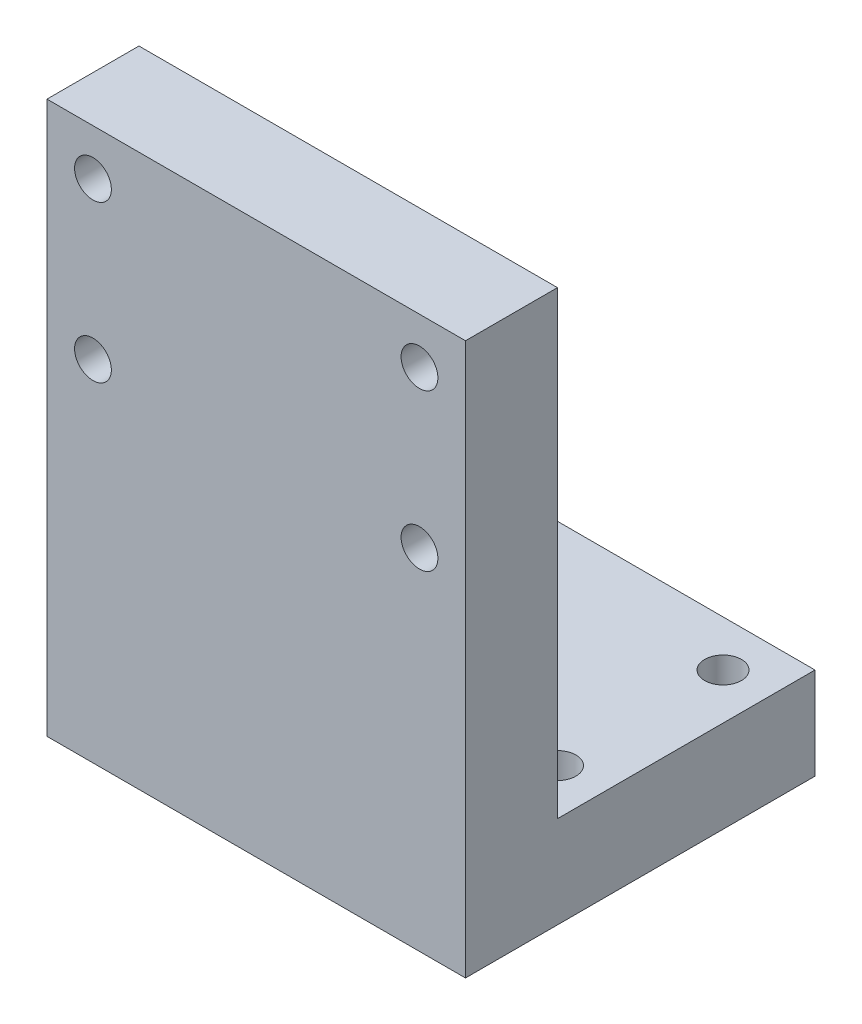
ISO-10303-21;
HEADER;
FILE_DESCRIPTION(('STEP AP214'),'2;1');
FILE_NAME('part.step','',(''),(''),'','','');
FILE_SCHEMA(('AUTOMOTIVE_DESIGN { 1 0 10303 214 1 1 1 1 }'));
ENDSEC;
DATA;
#1=APPLICATION_CONTEXT('core data for automotive mechanical design processes');
#2=APPLICATION_PROTOCOL_DEFINITION('international standard','automotive_design',2000,#1);
#3=PRODUCT_CONTEXT('',#1,'mechanical');
#4=PRODUCT('Part','Part','',(#3));
#5=PRODUCT_RELATED_PRODUCT_CATEGORY('part','',(#4));
#6=PRODUCT_DEFINITION_FORMATION('','',#4);
#7=PRODUCT_DEFINITION_CONTEXT('part definition',#1,'design');
#8=PRODUCT_DEFINITION('design','',#6,#7);
#9=PRODUCT_DEFINITION_SHAPE('','',#8);
#10=(LENGTH_UNIT() NAMED_UNIT(*) SI_UNIT(.MILLI.,.METRE.));
#11=(NAMED_UNIT(*) PLANE_ANGLE_UNIT() SI_UNIT($,.RADIAN.));
#12=(NAMED_UNIT(*) SI_UNIT($,.STERADIAN.) SOLID_ANGLE_UNIT());
#13=UNCERTAINTY_MEASURE_WITH_UNIT(LENGTH_MEASURE(1.E-05),#10,'distance_accuracy_value','');
#14=(GEOMETRIC_REPRESENTATION_CONTEXT(3) GLOBAL_UNCERTAINTY_ASSIGNED_CONTEXT((#13)) GLOBAL_UNIT_ASSIGNED_CONTEXT((#10,
#11,#12)) REPRESENTATION_CONTEXT('',''));
#15=CARTESIAN_POINT('',(0.,0.,0.));
#16=DIRECTION('',(0.,0.,1.));
#17=DIRECTION('',(1.,0.,0.));
#18=AXIS2_PLACEMENT_3D('',#15,#16,#17);
#19=CARTESIAN_POINT('',(17.75,55.,24.001));
#20=DIRECTION('',(0.,0.,-1.));
#21=DIRECTION('',(-1.,0.,0.));
#22=AXIS2_PLACEMENT_3D('',#19,#20,#21);
#23=CYLINDRICAL_SURFACE('',#22,2.00000000000001);
#24=CARTESIAN_POINT('',(17.75,55.,24.));
#25=DIRECTION('',(0.,0.,-1.));
#26=DIRECTION('',(-1.,0.,0.));
#27=AXIS2_PLACEMENT_3D('',#24,#25,#26);
#28=CIRCLE('',#27,2.00000000000001);
#29=CARTESIAN_POINT('',(15.75,55.,24.));
#30=VERTEX_POINT('',#29);
#31=EDGE_CURVE('E182',#30,#30,#28,.F.);
#32=ORIENTED_EDGE('',*,*,#31,.T.);
#33=EDGE_LOOP('',(#32));
#34=FACE_BOUND('',#33,.T.);
#35=CARTESIAN_POINT('',(17.75,55.,20.));
#36=DIRECTION('',(0.,0.,-1.));
#37=DIRECTION('',(-1.,0.,0.));
#38=AXIS2_PLACEMENT_3D('',#35,#36,#37);
#39=CIRCLE('',#38,2.00000000000001);
#40=CARTESIAN_POINT('',(15.75,55.,20.));
#41=VERTEX_POINT('',#40);
#42=EDGE_CURVE('E49',#41,#41,#39,.F.);
#43=ORIENTED_EDGE('',*,*,#42,.F.);
#44=EDGE_LOOP('',(#43));
#45=FACE_BOUND('',#44,.T.);
#46=ADVANCED_FACE('F45',(#34,#45),#23,.F.);
#47=CARTESIAN_POINT('',(17.75,38.,24.001));
#48=DIRECTION('',(0.,0.,-1.));
#49=DIRECTION('',(-1.,0.,0.));
#50=AXIS2_PLACEMENT_3D('',#47,#48,#49);
#51=CYLINDRICAL_SURFACE('',#50,2.00000000000001);
#52=CARTESIAN_POINT('',(17.75,38.,24.));
#53=DIRECTION('',(0.,0.,-1.));
#54=DIRECTION('',(-1.,0.,0.));
#55=AXIS2_PLACEMENT_3D('',#52,#53,#54);
#56=CIRCLE('',#55,2.00000000000001);
#57=CARTESIAN_POINT('',(15.75,38.,24.));
#58=VERTEX_POINT('',#57);
#59=EDGE_CURVE('E178',#58,#58,#56,.F.);
#60=ORIENTED_EDGE('',*,*,#59,.T.);
#61=EDGE_LOOP('',(#60));
#62=FACE_BOUND('',#61,.T.);
#63=CARTESIAN_POINT('',(17.75,38.,20.));
#64=DIRECTION('',(0.,0.,-1.));
#65=DIRECTION('',(-1.,0.,0.));
#66=AXIS2_PLACEMENT_3D('',#63,#64,#65);
#67=CIRCLE('',#66,2.00000000000001);
#68=CARTESIAN_POINT('',(15.75,38.,20.));
#69=VERTEX_POINT('',#68);
#70=EDGE_CURVE('E160',#69,#69,#67,.F.);
#71=ORIENTED_EDGE('',*,*,#70,.F.);
#72=EDGE_LOOP('',(#71));
#73=FACE_BOUND('',#72,.T.);
#74=ADVANCED_FACE('F318',(#62,#73),#51,.F.);
#75=CARTESIAN_POINT('',(-17.75,10.,-9.));
#76=DIRECTION('',(0.,-1.,0.));
#77=DIRECTION('',(0.,0.,-1.));
#78=AXIS2_PLACEMENT_3D('',#75,#76,#77);
#79=CYLINDRICAL_SURFACE('',#78,2.00000000000001);
#80=CARTESIAN_POINT('',(-17.75,10.,-9.));
#81=DIRECTION('',(0.,1.,0.));
#82=DIRECTION('',(0.,0.,1.));
#83=AXIS2_PLACEMENT_3D('',#80,#81,#82);
#84=CIRCLE('',#83,2.00000000000001);
#85=CARTESIAN_POINT('',(-17.75,10.,-6.99999999999999));
#86=VERTEX_POINT('',#85);
#87=EDGE_CURVE('E126',#86,#86,#84,.T.);
#88=ORIENTED_EDGE('',*,*,#87,.T.);
#89=EDGE_LOOP('',(#88));
#90=FACE_BOUND('',#89,.T.);
#91=CARTESIAN_POINT('',(-17.75,6.,-9.));
#92=DIRECTION('',(0.,-1.,0.));
#93=DIRECTION('',(0.,0.,-1.));
#94=AXIS2_PLACEMENT_3D('',#91,#92,#93);
#95=CIRCLE('',#94,2.00000000000001);
#96=CARTESIAN_POINT('',(-17.75,6.,-11.));
#97=VERTEX_POINT('',#96);
#98=EDGE_CURVE('E147',#97,#97,#95,.T.);
#99=ORIENTED_EDGE('',*,*,#98,.T.);
#100=EDGE_LOOP('',(#99));
#101=FACE_BOUND('',#100,.T.);
#102=ADVANCED_FACE('F325',(#90,#101),#79,.F.);
#103=CARTESIAN_POINT('',(-17.75,10.,9.));
#104=DIRECTION('',(0.,-1.,0.));
#105=DIRECTION('',(0.,0.,-1.));
#106=AXIS2_PLACEMENT_3D('',#103,#104,#105);
#107=CYLINDRICAL_SURFACE('',#106,2.00000000000001);
#108=CARTESIAN_POINT('',(-17.75,10.,9.));
#109=DIRECTION('',(0.,1.,0.));
#110=DIRECTION('',(0.,0.,1.));
#111=AXIS2_PLACEMENT_3D('',#108,#109,#110);
#112=CIRCLE('',#111,2.00000000000001);
#113=CARTESIAN_POINT('',(-17.75,10.,11.));
#114=VERTEX_POINT('',#113);
#115=EDGE_CURVE('E251',#114,#114,#112,.T.);
#116=ORIENTED_EDGE('',*,*,#115,.T.);
#117=EDGE_LOOP('',(#116));
#118=FACE_BOUND('',#117,.T.);
#119=CARTESIAN_POINT('',(-17.75,6.,9.));
#120=DIRECTION('',(0.,-1.,0.));
#121=DIRECTION('',(0.,0.,-1.));
#122=AXIS2_PLACEMENT_3D('',#119,#120,#121);
#123=CIRCLE('',#122,2.00000000000001);
#124=CARTESIAN_POINT('',(-17.75,6.,6.99999999999998));
#125=VERTEX_POINT('',#124);
#126=EDGE_CURVE('E143',#125,#125,#123,.T.);
#127=ORIENTED_EDGE('',*,*,#126,.T.);
#128=EDGE_LOOP('',(#127));
#129=FACE_BOUND('',#128,.T.);
#130=ADVANCED_FACE('F378',(#118,#129),#107,.F.);
#131=CARTESIAN_POINT('',(0.,10.,0.));
#132=DIRECTION('',(0.,1.,0.));
#133=DIRECTION('',(0.,0.,1.));
#134=AXIS2_PLACEMENT_3D('',#131,#132,#133);
#135=PLANE('',#134);
#136=CARTESIAN_POINT('',(17.75,10.,-9.00000000000001));
#137=DIRECTION('',(0.,1.,0.));
#138=DIRECTION('',(0.,0.,1.));
#139=AXIS2_PLACEMENT_3D('',#136,#137,#138);
#140=CIRCLE('',#139,2.00000000000001);
#141=CARTESIAN_POINT('',(17.75,10.,-6.99999999999999));
#142=VERTEX_POINT('',#141);
#143=EDGE_CURVE('E247',#142,#142,#140,.T.);
#144=ORIENTED_EDGE('',*,*,#143,.F.);
#145=EDGE_LOOP('',(#144));
#146=FACE_BOUND('',#145,.T.);
#147=ORIENTED_EDGE('',*,*,#87,.F.);
#148=EDGE_LOOP('',(#147));
#149=FACE_BOUND('',#148,.T.);
#150=DIRECTION('',(0.,0.,1.));
#151=VECTOR('',#150,1.);
#152=CARTESIAN_POINT('',(-22.75,10.,-14.));
#153=LINE('',#152,#151);
#154=CARTESIAN_POINT('',(-22.75,10.,-14.));
#155=VERTEX_POINT('',#154);
#156=CARTESIAN_POINT('',(-22.75,10.,14.));
#157=VERTEX_POINT('',#156);
#158=EDGE_CURVE('E111',#155,#157,#153,.T.);
#159=ORIENTED_EDGE('',*,*,#158,.T.);
#160=DIRECTION('',(1.,0.,0.));
#161=VECTOR('',#160,1.);
#162=CARTESIAN_POINT('',(-22.75,10.,14.));
#163=LINE('',#162,#161);
#164=CARTESIAN_POINT('',(22.75,10.,14.));
#165=VERTEX_POINT('',#164);
#166=EDGE_CURVE('E86',#157,#165,#163,.T.);
#167=ORIENTED_EDGE('',*,*,#166,.T.);
#168=DIRECTION('',(0.,0.,-1.));
#169=VECTOR('',#168,1.);
#170=CARTESIAN_POINT('',(22.75,10.,-14.));
#171=LINE('',#170,#169);
#172=CARTESIAN_POINT('',(22.75,10.,-14.));
#173=VERTEX_POINT('',#172);
#174=EDGE_CURVE('E108',#165,#173,#171,.T.);
#175=ORIENTED_EDGE('',*,*,#174,.T.);
#176=DIRECTION('',(-1.,0.,0.));
#177=VECTOR('',#176,1.);
#178=CARTESIAN_POINT('',(0.,10.,-14.));
#179=LINE('',#178,#177);
#180=EDGE_CURVE('E65',#173,#155,#179,.T.);
#181=ORIENTED_EDGE('',*,*,#180,.T.);
#182=EDGE_LOOP('',(#159,#167,#175,#181));
#183=FACE_BOUND('',#182,.T.);
#184=ORIENTED_EDGE('',*,*,#115,.F.);
#185=EDGE_LOOP('',(#184));
#186=FACE_BOUND('',#185,.T.);
#187=CARTESIAN_POINT('',(17.75,10.,9.));
#188=DIRECTION('',(0.,1.,0.));
#189=DIRECTION('',(0.,0.,1.));
#190=AXIS2_PLACEMENT_3D('',#187,#188,#189);
#191=CIRCLE('',#190,2.00000000000001);
#192=CARTESIAN_POINT('',(17.75,10.,11.));
#193=VERTEX_POINT('',#192);
#194=EDGE_CURVE('E151',#193,#193,#191,.T.);
#195=ORIENTED_EDGE('',*,*,#194,.F.);
#196=EDGE_LOOP('',(#195));
#197=FACE_BOUND('',#196,.T.);
#198=ADVANCED_FACE('F106',(#146,#149,#183,#186,#197),#135,.T.);
#199=CARTESIAN_POINT('',(0.,0.,0.));
#200=DIRECTION('',(0.,1.,0.));
#201=DIRECTION('',(0.,0.,1.));
#202=AXIS2_PLACEMENT_3D('',#199,#200,#201);
#203=PLANE('',#202);
#204=CARTESIAN_POINT('',(17.75,0.,9.));
#205=DIRECTION('',(0.,-1.,0.));
#206=DIRECTION('',(0.,0.,1.));
#207=AXIS2_PLACEMENT_3D('',#204,#205,#206);
#208=CIRCLE('',#207,3.);
#209=CARTESIAN_POINT('',(17.75,0.,12.));
#210=VERTEX_POINT('',#209);
#211=EDGE_CURVE('E231',#210,#210,#208,.T.);
#212=ORIENTED_EDGE('',*,*,#211,.F.);
#213=EDGE_LOOP('',(#212));
#214=FACE_BOUND('',#213,.T.);
#215=CARTESIAN_POINT('',(17.75,0.,-9.));
#216=DIRECTION('',(0.,-1.,0.));
#217=DIRECTION('',(0.,0.,1.));
#218=AXIS2_PLACEMENT_3D('',#215,#216,#217);
#219=CIRCLE('',#218,3.);
#220=CARTESIAN_POINT('',(17.75,0.,-6.));
#221=VERTEX_POINT('',#220);
#222=EDGE_CURVE('E223',#221,#221,#219,.T.);
#223=ORIENTED_EDGE('',*,*,#222,.F.);
#224=EDGE_LOOP('',(#223));
#225=FACE_BOUND('',#224,.T.);
#226=CARTESIAN_POINT('',(-17.75,0.,-9.));
#227=DIRECTION('',(0.,-1.,0.));
#228=DIRECTION('',(0.,0.,-1.));
#229=AXIS2_PLACEMENT_3D('',#226,#227,#228);
#230=CIRCLE('',#229,3.);
#231=CARTESIAN_POINT('',(-17.75,0.,-12.));
#232=VERTEX_POINT('',#231);
#233=EDGE_CURVE('E214',#232,#232,#230,.T.);
#234=ORIENTED_EDGE('',*,*,#233,.F.);
#235=EDGE_LOOP('',(#234));
#236=FACE_BOUND('',#235,.T.);
#237=CARTESIAN_POINT('',(-17.75,0.,9.));
#238=DIRECTION('',(0.,-1.,0.));
#239=DIRECTION('',(0.,0.,-1.));
#240=AXIS2_PLACEMENT_3D('',#237,#238,#239);
#241=CIRCLE('',#240,3.);
#242=CARTESIAN_POINT('',(-17.75,0.,6.));
#243=VERTEX_POINT('',#242);
#244=EDGE_CURVE('E218',#243,#243,#241,.T.);
#245=ORIENTED_EDGE('',*,*,#244,.F.);
#246=EDGE_LOOP('',(#245));
#247=FACE_BOUND('',#246,.T.);
#248=DIRECTION('',(0.,0.,1.));
#249=VECTOR('',#248,1.);
#250=CARTESIAN_POINT('',(-22.75,0.,-14.));
#251=LINE('',#250,#249);
#252=CARTESIAN_POINT('',(-22.75,0.,-14.));
#253=VERTEX_POINT('',#252);
#254=CARTESIAN_POINT('',(-22.75,0.,24.));
#255=VERTEX_POINT('',#254);
#256=EDGE_CURVE('E121',#253,#255,#251,.T.);
#257=ORIENTED_EDGE('',*,*,#256,.F.);
#258=DIRECTION('',(-1.,0.,0.));
#259=VECTOR('',#258,1.);
#260=CARTESIAN_POINT('',(-22.75,0.,-14.));
#261=LINE('',#260,#259);
#262=CARTESIAN_POINT('',(22.75,0.,-14.));
#263=VERTEX_POINT('',#262);
#264=EDGE_CURVE('E77',#263,#253,#261,.T.);
#265=ORIENTED_EDGE('',*,*,#264,.F.);
#266=DIRECTION('',(0.,0.,-1.));
#267=VECTOR('',#266,1.);
#268=CARTESIAN_POINT('',(22.75,0.,-14.));
#269=LINE('',#268,#267);
#270=CARTESIAN_POINT('',(22.75,0.,24.));
#271=VERTEX_POINT('',#270);
#272=EDGE_CURVE('E125',#271,#263,#269,.T.);
#273=ORIENTED_EDGE('',*,*,#272,.F.);
#274=DIRECTION('',(1.,0.,0.));
#275=VECTOR('',#274,1.);
#276=CARTESIAN_POINT('',(22.75,0.,24.));
#277=LINE('',#276,#275);
#278=EDGE_CURVE('E186',#255,#271,#277,.T.);
#279=ORIENTED_EDGE('',*,*,#278,.F.);
#280=EDGE_LOOP('',(#257,#265,#273,#279));
#281=FACE_BOUND('',#280,.T.);
#282=ADVANCED_FACE('F387',(#214,#225,#236,#247,#281),#203,.F.);
#283=CARTESIAN_POINT('',(-22.75,10.,-14.));
#284=DIRECTION('',(1.,0.,0.));
#285=DIRECTION('',(0.,0.,-1.));
#286=AXIS2_PLACEMENT_3D('',#283,#284,#285);
#287=PLANE('',#286);
#288=ORIENTED_EDGE('',*,*,#256,.T.);
#289=DIRECTION('',(0.,-1.,0.));
#290=VECTOR('',#289,1.);
#291=CARTESIAN_POINT('',(-22.75,60.,24.));
#292=LINE('',#291,#290);
#293=CARTESIAN_POINT('',(-22.75,60.,24.));
#294=VERTEX_POINT('',#293);
#295=EDGE_CURVE('E209',#294,#255,#292,.T.);
#296=ORIENTED_EDGE('',*,*,#295,.F.);
#297=DIRECTION('',(0.,0.,1.));
#298=VECTOR('',#297,1.);
#299=CARTESIAN_POINT('',(-22.75,60.,24.));
#300=LINE('',#299,#298);
#301=CARTESIAN_POINT('',(-22.75,60.,14.));
#302=VERTEX_POINT('',#301);
#303=EDGE_CURVE('E187',#302,#294,#300,.T.);
#304=ORIENTED_EDGE('',*,*,#303,.F.);
#305=DIRECTION('',(0.,-1.,0.));
#306=VECTOR('',#305,1.);
#307=CARTESIAN_POINT('',(-22.75,60.,14.));
#308=LINE('',#307,#306);
#309=EDGE_CURVE('E104',#302,#157,#308,.T.);
#310=ORIENTED_EDGE('',*,*,#309,.T.);
#311=ORIENTED_EDGE('',*,*,#158,.F.);
#312=DIRECTION('',(0.,-1.,0.));
#313=VECTOR('',#312,1.);
#314=CARTESIAN_POINT('',(-22.75,10.,-14.));
#315=LINE('',#314,#313);
#316=EDGE_CURVE('E56',#155,#253,#315,.T.);
#317=ORIENTED_EDGE('',*,*,#316,.T.);
#318=EDGE_LOOP('',(#288,#296,#304,#310,#311,#317));
#319=FACE_BOUND('',#318,.T.);
#320=ADVANCED_FACE('F47',(#319),#287,.F.);
#321=CARTESIAN_POINT('',(22.75,10.,-14.));
#322=DIRECTION('',(-1.,0.,0.));
#323=DIRECTION('',(0.,0.,1.));
#324=AXIS2_PLACEMENT_3D('',#321,#322,#323);
#325=PLANE('',#324);
#326=ORIENTED_EDGE('',*,*,#272,.T.);
#327=DIRECTION('',(0.,-1.,0.));
#328=VECTOR('',#327,1.);
#329=CARTESIAN_POINT('',(22.75,10.,-14.));
#330=LINE('',#329,#328);
#331=EDGE_CURVE('E11',#173,#263,#330,.T.);
#332=ORIENTED_EDGE('',*,*,#331,.F.);
#333=ORIENTED_EDGE('',*,*,#174,.F.);
#334=DIRECTION('',(0.,-1.,0.));
#335=VECTOR('',#334,1.);
#336=CARTESIAN_POINT('',(22.75,60.,14.));
#337=LINE('',#336,#335);
#338=CARTESIAN_POINT('',(22.75,60.,14.));
#339=VERTEX_POINT('',#338);
#340=EDGE_CURVE('E96',#339,#165,#337,.T.);
#341=ORIENTED_EDGE('',*,*,#340,.F.);
#342=DIRECTION('',(0.,0.,-1.));
#343=VECTOR('',#342,1.);
#344=CARTESIAN_POINT('',(22.75,60.,14.));
#345=LINE('',#344,#343);
#346=CARTESIAN_POINT('',(22.75,60.,24.));
#347=VERTEX_POINT('',#346);
#348=EDGE_CURVE('E195',#347,#339,#345,.T.);
#349=ORIENTED_EDGE('',*,*,#348,.F.);
#350=DIRECTION('',(0.,-1.,0.));
#351=VECTOR('',#350,1.);
#352=CARTESIAN_POINT('',(22.75,60.,24.));
#353=LINE('',#352,#351);
#354=EDGE_CURVE('E103',#347,#271,#353,.T.);
#355=ORIENTED_EDGE('',*,*,#354,.T.);
#356=EDGE_LOOP('',(#326,#332,#333,#341,#349,#355));
#357=FACE_BOUND('',#356,.T.);
#358=ADVANCED_FACE('F114',(#357),#325,.F.);
#359=CARTESIAN_POINT('',(-22.75,10.,-14.));
#360=DIRECTION('',(0.,0.,1.));
#361=DIRECTION('',(1.,0.,0.));
#362=AXIS2_PLACEMENT_3D('',#359,#360,#361);
#363=PLANE('',#362);
#364=ORIENTED_EDGE('',*,*,#264,.T.);
#365=ORIENTED_EDGE('',*,*,#316,.F.);
#366=ORIENTED_EDGE('',*,*,#180,.F.);
#367=ORIENTED_EDGE('',*,*,#331,.T.);
#368=EDGE_LOOP('',(#364,#365,#366,#367));
#369=FACE_BOUND('',#368,.T.);
#370=ADVANCED_FACE('F376',(#369),#363,.F.);
#371=CARTESIAN_POINT('',(17.75,10.,-9.00000000000001));
#372=DIRECTION('',(0.,-1.,0.));
#373=DIRECTION('',(0.,0.,-1.));
#374=AXIS2_PLACEMENT_3D('',#371,#372,#373);
#375=CYLINDRICAL_SURFACE('',#374,2.00000000000001);
#376=CARTESIAN_POINT('',(17.75,6.,-9.00000000000001));
#377=DIRECTION('',(0.,1.,0.));
#378=DIRECTION('',(0.,0.,1.));
#379=AXIS2_PLACEMENT_3D('',#376,#377,#378);
#380=CIRCLE('',#379,2.00000000000001);
#381=CARTESIAN_POINT('',(17.75,6.,-6.99999999999999));
#382=VERTEX_POINT('',#381);
#383=EDGE_CURVE('E138',#382,#382,#380,.T.);
#384=ORIENTED_EDGE('',*,*,#383,.F.);
#385=EDGE_LOOP('',(#384));
#386=FACE_BOUND('',#385,.T.);
#387=ORIENTED_EDGE('',*,*,#143,.T.);
#388=EDGE_LOOP('',(#387));
#389=FACE_BOUND('',#388,.T.);
#390=ADVANCED_FACE('F372',(#386,#389),#375,.F.);
#391=CARTESIAN_POINT('',(17.75,10.,9.));
#392=DIRECTION('',(0.,-1.,0.));
#393=DIRECTION('',(0.,0.,-1.));
#394=AXIS2_PLACEMENT_3D('',#391,#392,#393);
#395=CYLINDRICAL_SURFACE('',#394,2.00000000000001);
#396=CARTESIAN_POINT('',(17.75,6.,9.));
#397=DIRECTION('',(0.,1.,0.));
#398=DIRECTION('',(0.,0.,1.));
#399=AXIS2_PLACEMENT_3D('',#396,#397,#398);
#400=CIRCLE('',#399,2.00000000000001);
#401=CARTESIAN_POINT('',(17.75,6.,11.));
#402=VERTEX_POINT('',#401);
#403=EDGE_CURVE('E134',#402,#402,#400,.T.);
#404=ORIENTED_EDGE('',*,*,#403,.F.);
#405=EDGE_LOOP('',(#404));
#406=FACE_BOUND('',#405,.T.);
#407=ORIENTED_EDGE('',*,*,#194,.T.);
#408=EDGE_LOOP('',(#407));
#409=FACE_BOUND('',#408,.T.);
#410=ADVANCED_FACE('F359',(#406,#409),#395,.F.);
#411=CARTESIAN_POINT('',(17.75,6.,9.));
#412=DIRECTION('',(0.,-1.,0.));
#413=DIRECTION('',(0.,0.,-1.));
#414=AXIS2_PLACEMENT_3D('',#411,#412,#413);
#415=CYLINDRICAL_SURFACE('',#414,3.);
#416=CARTESIAN_POINT('',(17.75,6.,9.));
#417=DIRECTION('',(0.,-1.,0.));
#418=DIRECTION('',(0.,0.,1.));
#419=AXIS2_PLACEMENT_3D('',#416,#417,#418);
#420=CIRCLE('',#419,3.);
#421=CARTESIAN_POINT('',(17.75,6.,12.));
#422=VERTEX_POINT('',#421);
#423=EDGE_CURVE('E213',#422,#422,#420,.T.);
#424=ORIENTED_EDGE('',*,*,#423,.F.);
#425=EDGE_LOOP('',(#424));
#426=FACE_BOUND('',#425,.T.);
#427=ORIENTED_EDGE('',*,*,#211,.T.);
#428=EDGE_LOOP('',(#427));
#429=FACE_BOUND('',#428,.T.);
#430=ADVANCED_FACE('F356',(#426,#429),#415,.F.);
#431=CARTESIAN_POINT('',(17.75,6.,9.));
#432=DIRECTION('',(0.,1.,0.));
#433=DIRECTION('',(0.,0.,1.));
#434=AXIS2_PLACEMENT_3D('',#431,#432,#433);
#435=PLANE('',#434);
#436=ORIENTED_EDGE('',*,*,#403,.T.);
#437=EDGE_LOOP('',(#436));
#438=FACE_BOUND('',#437,.T.);
#439=ORIENTED_EDGE('',*,*,#423,.T.);
#440=EDGE_LOOP('',(#439));
#441=FACE_BOUND('',#440,.T.);
#442=ADVANCED_FACE('F350',(#438,#441),#435,.F.);
#443=CARTESIAN_POINT('',(17.75,6.,-9.));
#444=DIRECTION('',(0.,-1.,0.));
#445=DIRECTION('',(0.,0.,-1.));
#446=AXIS2_PLACEMENT_3D('',#443,#444,#445);
#447=CYLINDRICAL_SURFACE('',#446,3.);
#448=CARTESIAN_POINT('',(17.75,6.,-9.));
#449=DIRECTION('',(0.,-1.,0.));
#450=DIRECTION('',(0.,0.,1.));
#451=AXIS2_PLACEMENT_3D('',#448,#449,#450);
#452=CIRCLE('',#451,3.);
#453=CARTESIAN_POINT('',(17.75,6.,-6.));
#454=VERTEX_POINT('',#453);
#455=EDGE_CURVE('E227',#454,#454,#452,.T.);
#456=ORIENTED_EDGE('',*,*,#455,.F.);
#457=EDGE_LOOP('',(#456));
#458=FACE_BOUND('',#457,.T.);
#459=ORIENTED_EDGE('',*,*,#222,.T.);
#460=EDGE_LOOP('',(#459));
#461=FACE_BOUND('',#460,.T.);
#462=ADVANCED_FACE('F346',(#458,#461),#447,.F.);
#463=CARTESIAN_POINT('',(17.75,6.,-9.));
#464=DIRECTION('',(0.,1.,0.));
#465=DIRECTION('',(0.,0.,1.));
#466=AXIS2_PLACEMENT_3D('',#463,#464,#465);
#467=PLANE('',#466);
#468=ORIENTED_EDGE('',*,*,#383,.T.);
#469=EDGE_LOOP('',(#468));
#470=FACE_BOUND('',#469,.T.);
#471=ORIENTED_EDGE('',*,*,#455,.T.);
#472=EDGE_LOOP('',(#471));
#473=FACE_BOUND('',#472,.T.);
#474=ADVANCED_FACE('F349',(#470,#473),#467,.F.);
#475=CARTESIAN_POINT('',(-17.75,6.,9.));
#476=DIRECTION('',(0.,-1.,0.));
#477=DIRECTION('',(0.,0.,-1.));
#478=AXIS2_PLACEMENT_3D('',#475,#476,#477);
#479=CYLINDRICAL_SURFACE('',#478,3.);
#480=CARTESIAN_POINT('',(-17.75,6.,9.));
#481=DIRECTION('',(0.,-1.,0.));
#482=DIRECTION('',(0.,0.,-1.));
#483=AXIS2_PLACEMENT_3D('',#480,#481,#482);
#484=CIRCLE('',#483,3.);
#485=CARTESIAN_POINT('',(-17.75,6.,6.));
#486=VERTEX_POINT('',#485);
#487=EDGE_CURVE('E139',#486,#486,#484,.T.);
#488=ORIENTED_EDGE('',*,*,#487,.F.);
#489=EDGE_LOOP('',(#488));
#490=FACE_BOUND('',#489,.T.);
#491=ORIENTED_EDGE('',*,*,#244,.T.);
#492=EDGE_LOOP('',(#491));
#493=FACE_BOUND('',#492,.T.);
#494=ADVANCED_FACE('F354',(#490,#493),#479,.F.);
#495=CARTESIAN_POINT('',(-17.75,6.,9.));
#496=DIRECTION('',(0.,-1.,0.));
#497=DIRECTION('',(0.,0.,-1.));
#498=AXIS2_PLACEMENT_3D('',#495,#496,#497);
#499=PLANE('',#498);
#500=ORIENTED_EDGE('',*,*,#126,.F.);
#501=EDGE_LOOP('',(#500));
#502=FACE_BOUND('',#501,.T.);
#503=ORIENTED_EDGE('',*,*,#487,.T.);
#504=EDGE_LOOP('',(#503));
#505=FACE_BOUND('',#504,.T.);
#506=ADVANCED_FACE('F341',(#502,#505),#499,.T.);
#507=CARTESIAN_POINT('',(-17.75,6.,-9.));
#508=DIRECTION('',(0.,-1.,0.));
#509=DIRECTION('',(0.,0.,-1.));
#510=AXIS2_PLACEMENT_3D('',#507,#508,#509);
#511=CYLINDRICAL_SURFACE('',#510,3.);
#512=CARTESIAN_POINT('',(-17.75,6.,-9.));
#513=DIRECTION('',(0.,-1.,0.));
#514=DIRECTION('',(0.,0.,-1.));
#515=AXIS2_PLACEMENT_3D('',#512,#513,#514);
#516=CIRCLE('',#515,3.);
#517=CARTESIAN_POINT('',(-17.75,6.,-12.));
#518=VERTEX_POINT('',#517);
#519=EDGE_CURVE('E219',#518,#518,#516,.T.);
#520=ORIENTED_EDGE('',*,*,#519,.F.);
#521=EDGE_LOOP('',(#520));
#522=FACE_BOUND('',#521,.T.);
#523=ORIENTED_EDGE('',*,*,#233,.T.);
#524=EDGE_LOOP('',(#523));
#525=FACE_BOUND('',#524,.T.);
#526=ADVANCED_FACE('F338',(#522,#525),#511,.F.);
#527=CARTESIAN_POINT('',(-17.75,6.,-9.));
#528=DIRECTION('',(0.,-1.,0.));
#529=DIRECTION('',(0.,0.,-1.));
#530=AXIS2_PLACEMENT_3D('',#527,#528,#529);
#531=PLANE('',#530);
#532=ORIENTED_EDGE('',*,*,#98,.F.);
#533=EDGE_LOOP('',(#532));
#534=FACE_BOUND('',#533,.T.);
#535=ORIENTED_EDGE('',*,*,#519,.T.);
#536=EDGE_LOOP('',(#535));
#537=FACE_BOUND('',#536,.T.);
#538=ADVANCED_FACE('F336',(#534,#537),#531,.T.);
#539=CARTESIAN_POINT('',(22.75,60.,24.));
#540=DIRECTION('',(0.,0.,-1.));
#541=DIRECTION('',(-1.,0.,0.));
#542=AXIS2_PLACEMENT_3D('',#539,#540,#541);
#543=PLANE('',#542);
#544=CARTESIAN_POINT('',(-17.75,55.,24.));
#545=DIRECTION('',(0.,0.,-1.));
#546=DIRECTION('',(-1.,0.,0.));
#547=AXIS2_PLACEMENT_3D('',#544,#545,#546);
#548=CIRCLE('',#547,2.);
#549=CARTESIAN_POINT('',(-19.75,55.,24.));
#550=VERTEX_POINT('',#549);
#551=EDGE_CURVE('E167',#550,#550,#548,.F.);
#552=ORIENTED_EDGE('',*,*,#551,.F.);
#553=EDGE_LOOP('',(#552));
#554=FACE_BOUND('',#553,.T.);
#555=CARTESIAN_POINT('',(-17.75,38.,24.));
#556=DIRECTION('',(0.,0.,-1.));
#557=DIRECTION('',(-1.,0.,0.));
#558=AXIS2_PLACEMENT_3D('',#555,#556,#557);
#559=CIRCLE('',#558,2.);
#560=CARTESIAN_POINT('',(-19.75,38.,24.));
#561=VERTEX_POINT('',#560);
#562=EDGE_CURVE('E172',#561,#561,#559,.F.);
#563=ORIENTED_EDGE('',*,*,#562,.F.);
#564=EDGE_LOOP('',(#563));
#565=FACE_BOUND('',#564,.T.);
#566=ORIENTED_EDGE('',*,*,#59,.F.);
#567=EDGE_LOOP('',(#566));
#568=FACE_BOUND('',#567,.T.);
#569=ORIENTED_EDGE('',*,*,#31,.F.);
#570=EDGE_LOOP('',(#569));
#571=FACE_BOUND('',#570,.T.);
#572=ORIENTED_EDGE('',*,*,#278,.T.);
#573=ORIENTED_EDGE('',*,*,#354,.F.);
#574=DIRECTION('',(1.,0.,0.));
#575=VECTOR('',#574,1.);
#576=CARTESIAN_POINT('',(22.75,60.,24.));
#577=LINE('',#576,#575);
#578=EDGE_CURVE('E191',#294,#347,#577,.T.);
#579=ORIENTED_EDGE('',*,*,#578,.F.);
#580=ORIENTED_EDGE('',*,*,#295,.T.);
#581=EDGE_LOOP('',(#572,#573,#579,#580));
#582=FACE_BOUND('',#581,.T.);
#583=ADVANCED_FACE('F300',(#554,#565,#568,#571,#582),#543,.F.);
#584=CARTESIAN_POINT('',(-22.75,60.,14.));
#585=DIRECTION('',(0.,0.,1.));
#586=DIRECTION('',(1.,0.,0.));
#587=AXIS2_PLACEMENT_3D('',#584,#585,#586);
#588=PLANE('',#587);
#589=CARTESIAN_POINT('',(-17.75,55.,14.));
#590=DIRECTION('',(0.,0.,-1.));
#591=DIRECTION('',(1.,0.,0.));
#592=AXIS2_PLACEMENT_3D('',#589,#590,#591);
#593=CIRCLE('',#592,3.);
#594=CARTESIAN_POINT('',(-14.75,55.,14.));
#595=VERTEX_POINT('',#594);
#596=EDGE_CURVE('E275',#595,#595,#593,.T.);
#597=ORIENTED_EDGE('',*,*,#596,.F.);
#598=EDGE_LOOP('',(#597));
#599=FACE_BOUND('',#598,.T.);
#600=CARTESIAN_POINT('',(-17.75,38.,14.));
#601=DIRECTION('',(0.,0.,-1.));
#602=DIRECTION('',(1.,0.,0.));
#603=AXIS2_PLACEMENT_3D('',#600,#601,#602);
#604=CIRCLE('',#603,3.);
#605=CARTESIAN_POINT('',(-14.75,38.,14.));
#606=VERTEX_POINT('',#605);
#607=EDGE_CURVE('E283',#606,#606,#604,.T.);
#608=ORIENTED_EDGE('',*,*,#607,.F.);
#609=EDGE_LOOP('',(#608));
#610=FACE_BOUND('',#609,.T.);
#611=CARTESIAN_POINT('',(17.75,38.,14.));
#612=DIRECTION('',(0.,0.,-1.));
#613=DIRECTION('',(-1.,0.,0.));
#614=AXIS2_PLACEMENT_3D('',#611,#612,#613);
#615=CIRCLE('',#614,3.);
#616=CARTESIAN_POINT('',(14.75,38.,14.));
#617=VERTEX_POINT('',#616);
#618=EDGE_CURVE('E267',#617,#617,#615,.T.);
#619=ORIENTED_EDGE('',*,*,#618,.F.);
#620=EDGE_LOOP('',(#619));
#621=FACE_BOUND('',#620,.T.);
#622=CARTESIAN_POINT('',(17.75,55.,14.));
#623=DIRECTION('',(0.,0.,-1.));
#624=DIRECTION('',(-1.,0.,0.));
#625=AXIS2_PLACEMENT_3D('',#622,#623,#624);
#626=CIRCLE('',#625,3.);
#627=CARTESIAN_POINT('',(14.75,55.,14.));
#628=VERTEX_POINT('',#627);
#629=EDGE_CURVE('E263',#628,#628,#626,.T.);
#630=ORIENTED_EDGE('',*,*,#629,.F.);
#631=EDGE_LOOP('',(#630));
#632=FACE_BOUND('',#631,.T.);
#633=ORIENTED_EDGE('',*,*,#166,.F.);
#634=ORIENTED_EDGE('',*,*,#309,.F.);
#635=DIRECTION('',(-1.,0.,0.));
#636=VECTOR('',#635,1.);
#637=CARTESIAN_POINT('',(-22.75,60.,14.));
#638=LINE('',#637,#636);
#639=EDGE_CURVE('E98',#339,#302,#638,.T.);
#640=ORIENTED_EDGE('',*,*,#639,.F.);
#641=ORIENTED_EDGE('',*,*,#340,.T.);
#642=EDGE_LOOP('',(#633,#634,#640,#641));
#643=FACE_BOUND('',#642,.T.);
#644=ADVANCED_FACE('F97',(#599,#610,#621,#632,#643),#588,.F.);
#645=CARTESIAN_POINT('',(0.,60.,0.));
#646=DIRECTION('',(0.,-1.,0.));
#647=DIRECTION('',(0.,0.,-1.));
#648=AXIS2_PLACEMENT_3D('',#645,#646,#647);
#649=PLANE('',#648);
#650=ORIENTED_EDGE('',*,*,#303,.T.);
#651=ORIENTED_EDGE('',*,*,#578,.T.);
#652=ORIENTED_EDGE('',*,*,#348,.T.);
#653=ORIENTED_EDGE('',*,*,#639,.T.);
#654=EDGE_LOOP('',(#650,#651,#652,#653));
#655=FACE_BOUND('',#654,.T.);
#656=ADVANCED_FACE('F299',(#655),#649,.F.);
#657=CARTESIAN_POINT('',(-17.75,38.,24.001));
#658=DIRECTION('',(0.,0.,-1.));
#659=DIRECTION('',(-1.,0.,0.));
#660=AXIS2_PLACEMENT_3D('',#657,#658,#659);
#661=CYLINDRICAL_SURFACE('',#660,2.);
#662=CARTESIAN_POINT('',(-17.75,38.,20.));
#663=DIRECTION('',(0.,0.,1.));
#664=DIRECTION('',(1.,0.,0.));
#665=AXIS2_PLACEMENT_3D('',#662,#663,#664);
#666=CIRCLE('',#665,2.);
#667=CARTESIAN_POINT('',(-15.75,38.,20.));
#668=VERTEX_POINT('',#667);
#669=EDGE_CURVE('E156',#668,#668,#666,.F.);
#670=ORIENTED_EDGE('',*,*,#669,.T.);
#671=EDGE_LOOP('',(#670));
#672=FACE_BOUND('',#671,.T.);
#673=ORIENTED_EDGE('',*,*,#562,.T.);
#674=EDGE_LOOP('',(#673));
#675=FACE_BOUND('',#674,.T.);
#676=ADVANCED_FACE('F332',(#672,#675),#661,.F.);
#677=CARTESIAN_POINT('',(-17.75,55.,24.001));
#678=DIRECTION('',(0.,0.,-1.));
#679=DIRECTION('',(-1.,0.,0.));
#680=AXIS2_PLACEMENT_3D('',#677,#678,#679);
#681=CYLINDRICAL_SURFACE('',#680,2.);
#682=CARTESIAN_POINT('',(-17.75,55.,20.));
#683=DIRECTION('',(0.,0.,1.));
#684=DIRECTION('',(1.,0.,0.));
#685=AXIS2_PLACEMENT_3D('',#682,#683,#684);
#686=CIRCLE('',#685,2.);
#687=CARTESIAN_POINT('',(-15.75,55.,20.));
#688=VERTEX_POINT('',#687);
#689=EDGE_CURVE('E152',#688,#688,#686,.F.);
#690=ORIENTED_EDGE('',*,*,#689,.T.);
#691=EDGE_LOOP('',(#690));
#692=FACE_BOUND('',#691,.T.);
#693=ORIENTED_EDGE('',*,*,#551,.T.);
#694=EDGE_LOOP('',(#693));
#695=FACE_BOUND('',#694,.T.);
#696=ADVANCED_FACE('F329',(#692,#695),#681,.F.);
#697=CARTESIAN_POINT('',(-17.75,55.,20.));
#698=DIRECTION('',(0.,0.,1.));
#699=DIRECTION('',(1.,0.,0.));
#700=AXIS2_PLACEMENT_3D('',#697,#698,#699);
#701=PLANE('',#700);
#702=CARTESIAN_POINT('',(-17.75,55.,20.));
#703=DIRECTION('',(0.,0.,-1.));
#704=DIRECTION('',(1.,0.,0.));
#705=AXIS2_PLACEMENT_3D('',#702,#703,#704);
#706=CIRCLE('',#705,3.);
#707=CARTESIAN_POINT('',(-14.75,55.,20.));
#708=VERTEX_POINT('',#707);
#709=EDGE_CURVE('E271',#708,#708,#706,.T.);
#710=ORIENTED_EDGE('',*,*,#709,.T.);
#711=EDGE_LOOP('',(#710));
#712=FACE_BOUND('',#711,.T.);
#713=ORIENTED_EDGE('',*,*,#689,.F.);
#714=EDGE_LOOP('',(#713));
#715=FACE_BOUND('',#714,.T.);
#716=ADVANCED_FACE('F541',(#712,#715),#701,.F.);
#717=CARTESIAN_POINT('',(-17.75,55.,20.));
#718=DIRECTION('',(0.,0.,-1.));
#719=DIRECTION('',(-1.,0.,0.));
#720=AXIS2_PLACEMENT_3D('',#717,#718,#719);
#721=CYLINDRICAL_SURFACE('',#720,3.);
#722=ORIENTED_EDGE('',*,*,#709,.F.);
#723=EDGE_LOOP('',(#722));
#724=FACE_BOUND('',#723,.T.);
#725=ORIENTED_EDGE('',*,*,#596,.T.);
#726=EDGE_LOOP('',(#725));
#727=FACE_BOUND('',#726,.T.);
#728=ADVANCED_FACE('F559',(#724,#727),#721,.F.);
#729=CARTESIAN_POINT('',(-17.75,38.,20.));
#730=DIRECTION('',(0.,0.,1.));
#731=DIRECTION('',(1.,0.,0.));
#732=AXIS2_PLACEMENT_3D('',#729,#730,#731);
#733=PLANE('',#732);
#734=CARTESIAN_POINT('',(-17.75,38.,20.));
#735=DIRECTION('',(0.,0.,-1.));
#736=DIRECTION('',(1.,0.,0.));
#737=AXIS2_PLACEMENT_3D('',#734,#735,#736);
#738=CIRCLE('',#737,3.);
#739=CARTESIAN_POINT('',(-14.75,38.,20.));
#740=VERTEX_POINT('',#739);
#741=EDGE_CURVE('E279',#740,#740,#738,.T.);
#742=ORIENTED_EDGE('',*,*,#741,.T.);
#743=EDGE_LOOP('',(#742));
#744=FACE_BOUND('',#743,.T.);
#745=ORIENTED_EDGE('',*,*,#669,.F.);
#746=EDGE_LOOP('',(#745));
#747=FACE_BOUND('',#746,.T.);
#748=ADVANCED_FACE('F569',(#744,#747),#733,.F.);
#749=CARTESIAN_POINT('',(-17.75,38.,20.));
#750=DIRECTION('',(0.,0.,-1.));
#751=DIRECTION('',(-1.,0.,0.));
#752=AXIS2_PLACEMENT_3D('',#749,#750,#751);
#753=CYLINDRICAL_SURFACE('',#752,3.);
#754=ORIENTED_EDGE('',*,*,#741,.F.);
#755=EDGE_LOOP('',(#754));
#756=FACE_BOUND('',#755,.T.);
#757=ORIENTED_EDGE('',*,*,#607,.T.);
#758=EDGE_LOOP('',(#757));
#759=FACE_BOUND('',#758,.T.);
#760=ADVANCED_FACE('F579',(#756,#759),#753,.F.);
#761=CARTESIAN_POINT('',(17.75,38.,20.));
#762=DIRECTION('',(0.,0.,-1.));
#763=DIRECTION('',(-1.,0.,0.));
#764=AXIS2_PLACEMENT_3D('',#761,#762,#763);
#765=PLANE('',#764);
#766=CARTESIAN_POINT('',(17.75,38.,20.));
#767=DIRECTION('',(0.,0.,-1.));
#768=DIRECTION('',(-1.,0.,0.));
#769=AXIS2_PLACEMENT_3D('',#766,#767,#768);
#770=CIRCLE('',#769,3.);
#771=CARTESIAN_POINT('',(14.75,38.,20.));
#772=VERTEX_POINT('',#771);
#773=EDGE_CURVE('E287',#772,#772,#770,.T.);
#774=ORIENTED_EDGE('',*,*,#773,.T.);
#775=EDGE_LOOP('',(#774));
#776=FACE_BOUND('',#775,.T.);
#777=ORIENTED_EDGE('',*,*,#70,.T.);
#778=EDGE_LOOP('',(#777));
#779=FACE_BOUND('',#778,.T.);
#780=ADVANCED_FACE('F589',(#776,#779),#765,.T.);
#781=CARTESIAN_POINT('',(17.75,38.,20.));
#782=DIRECTION('',(0.,0.,-1.));
#783=DIRECTION('',(-1.,0.,0.));
#784=AXIS2_PLACEMENT_3D('',#781,#782,#783);
#785=CYLINDRICAL_SURFACE('',#784,3.);
#786=ORIENTED_EDGE('',*,*,#773,.F.);
#787=EDGE_LOOP('',(#786));
#788=FACE_BOUND('',#787,.T.);
#789=ORIENTED_EDGE('',*,*,#618,.T.);
#790=EDGE_LOOP('',(#789));
#791=FACE_BOUND('',#790,.T.);
#792=ADVANCED_FACE('F295',(#788,#791),#785,.F.);
#793=CARTESIAN_POINT('',(17.75,55.,20.));
#794=DIRECTION('',(0.,0.,-1.));
#795=DIRECTION('',(-1.,0.,0.));
#796=AXIS2_PLACEMENT_3D('',#793,#794,#795);
#797=PLANE('',#796);
#798=CARTESIAN_POINT('',(17.75,55.,20.));
#799=DIRECTION('',(0.,0.,-1.));
#800=DIRECTION('',(-1.,0.,0.));
#801=AXIS2_PLACEMENT_3D('',#798,#799,#800);
#802=CIRCLE('',#801,3.);
#803=CARTESIAN_POINT('',(14.75,55.,20.));
#804=VERTEX_POINT('',#803);
#805=EDGE_CURVE('E157',#804,#804,#802,.T.);
#806=ORIENTED_EDGE('',*,*,#805,.T.);
#807=EDGE_LOOP('',(#806));
#808=FACE_BOUND('',#807,.T.);
#809=ORIENTED_EDGE('',*,*,#42,.T.);
#810=EDGE_LOOP('',(#809));
#811=FACE_BOUND('',#810,.T.);
#812=ADVANCED_FACE('F307',(#808,#811),#797,.T.);
#813=CARTESIAN_POINT('',(17.75,55.,20.));
#814=DIRECTION('',(0.,0.,-1.));
#815=DIRECTION('',(-1.,0.,0.));
#816=AXIS2_PLACEMENT_3D('',#813,#814,#815);
#817=CYLINDRICAL_SURFACE('',#816,3.);
#818=ORIENTED_EDGE('',*,*,#805,.F.);
#819=EDGE_LOOP('',(#818));
#820=FACE_BOUND('',#819,.T.);
#821=ORIENTED_EDGE('',*,*,#629,.T.);
#822=EDGE_LOOP('',(#821));
#823=FACE_BOUND('',#822,.T.);
#824=ADVANCED_FACE('F305',(#820,#823),#817,.F.);
#825=CLOSED_SHELL('',(#46,#74,#102,#130,#198,#282,#320,#358,#370,#390,#410,#430,#442,#462,#474,
#494,#506,#526,#538,#583,#644,#656,#676,#696,#716,#728,#748,#760,#780,#792,#812,#824));
#826=MANIFOLD_SOLID_BREP('B2',#825);
#827=ADVANCED_BREP_SHAPE_REPRESENTATION('',(#18,#826),#14);
#828=SHAPE_DEFINITION_REPRESENTATION(#9,#827);
ENDSEC;
END-ISO-10303-21;
